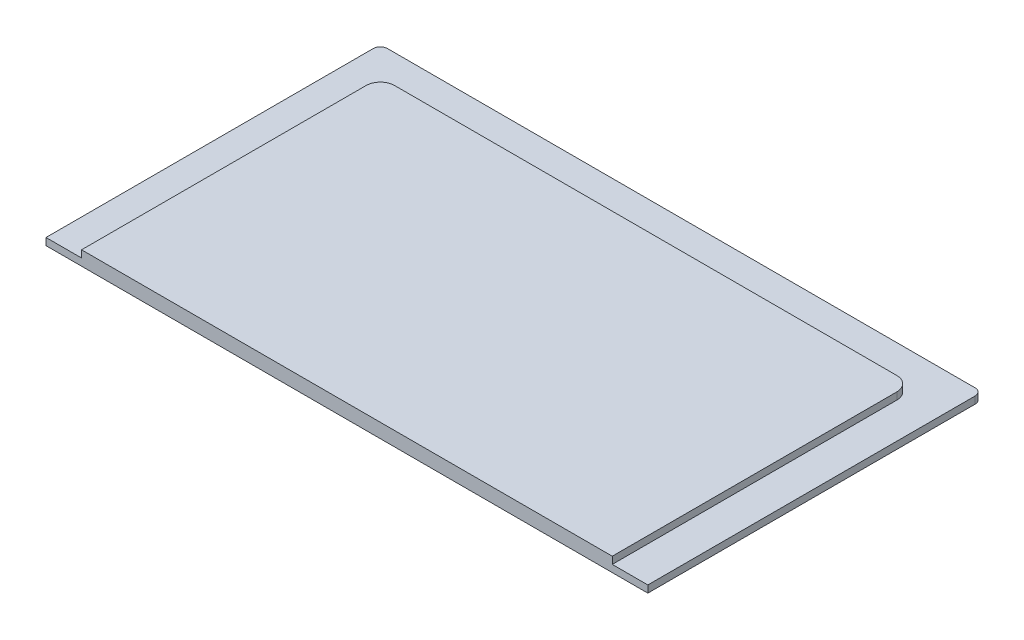
ISO-10303-21;
HEADER;
FILE_DESCRIPTION(('STEP AP214'),'2;1');
FILE_NAME('part.step','',(''),(''),'','','');
FILE_SCHEMA(('AUTOMOTIVE_DESIGN { 1 0 10303 214 1 1 1 1 }'));
ENDSEC;
DATA;
#1=APPLICATION_CONTEXT('core data for automotive mechanical design processes');
#2=APPLICATION_PROTOCOL_DEFINITION('international standard','automotive_design',2000,#1);
#3=PRODUCT_CONTEXT('',#1,'mechanical');
#4=PRODUCT('Part','Part','',(#3));
#5=PRODUCT_RELATED_PRODUCT_CATEGORY('part','',(#4));
#6=PRODUCT_DEFINITION_FORMATION('','',#4);
#7=PRODUCT_DEFINITION_CONTEXT('part definition',#1,'design');
#8=PRODUCT_DEFINITION('design','',#6,#7);
#9=PRODUCT_DEFINITION_SHAPE('','',#8);
#10=(LENGTH_UNIT() NAMED_UNIT(*) SI_UNIT(.MILLI.,.METRE.));
#11=(NAMED_UNIT(*) PLANE_ANGLE_UNIT() SI_UNIT($,.RADIAN.));
#12=(NAMED_UNIT(*) SI_UNIT($,.STERADIAN.) SOLID_ANGLE_UNIT());
#13=UNCERTAINTY_MEASURE_WITH_UNIT(LENGTH_MEASURE(1.E-05),#10,'distance_accuracy_value','');
#14=(GEOMETRIC_REPRESENTATION_CONTEXT(3) GLOBAL_UNCERTAINTY_ASSIGNED_CONTEXT((#13)) GLOBAL_UNIT_ASSIGNED_CONTEXT((#10,
#11,#12)) REPRESENTATION_CONTEXT('',''));
#15=CARTESIAN_POINT('',(0.,0.,0.));
#16=DIRECTION('',(0.,0.,1.));
#17=DIRECTION('',(1.,0.,0.));
#18=AXIS2_PLACEMENT_3D('',#15,#16,#17);
#19=CARTESIAN_POINT('',(37.3,1.,21.));
#20=DIRECTION('',(-1.,0.,0.));
#21=DIRECTION('',(0.,0.,1.));
#22=AXIS2_PLACEMENT_3D('',#19,#20,#21);
#23=PLANE('',#22);
#24=DIRECTION('',(0.,0.,-1.));
#25=VECTOR('',#24,1.);
#26=CARTESIAN_POINT('',(37.3,0.,21.));
#27=LINE('',#26,#25);
#28=CARTESIAN_POINT('',(37.3,0.,21.));
#29=VERTEX_POINT('',#28);
#30=CARTESIAN_POINT('',(37.3,0.,-19.));
#31=VERTEX_POINT('',#30);
#32=EDGE_CURVE('E145',#29,#31,#27,.T.);
#33=ORIENTED_EDGE('',*,*,#32,.T.);
#34=DIRECTION('',(0.,-1.,0.));
#35=VECTOR('',#34,1.);
#36=CARTESIAN_POINT('',(37.3,1.,-19.));
#37=LINE('',#36,#35);
#38=CARTESIAN_POINT('',(37.3,1.,-19.));
#39=VERTEX_POINT('',#38);
#40=EDGE_CURVE('E203',#31,#39,#37,.F.);
#41=ORIENTED_EDGE('',*,*,#40,.T.);
#42=DIRECTION('',(0.,0.,-1.));
#43=VECTOR('',#42,1.);
#44=CARTESIAN_POINT('',(37.3,1.,21.));
#45=LINE('',#44,#43);
#46=CARTESIAN_POINT('',(37.3,1.,21.));
#47=VERTEX_POINT('',#46);
#48=EDGE_CURVE('E164',#47,#39,#45,.T.);
#49=ORIENTED_EDGE('',*,*,#48,.F.);
#50=DIRECTION('',(0.,-1.,0.));
#51=VECTOR('',#50,1.);
#52=CARTESIAN_POINT('',(37.3,1.,21.));
#53=LINE('',#52,#51);
#54=EDGE_CURVE('E175',#47,#29,#53,.T.);
#55=ORIENTED_EDGE('',*,*,#54,.T.);
#56=EDGE_LOOP('',(#33,#41,#49,#55));
#57=FACE_BOUND('',#56,.T.);
#58=ADVANCED_FACE('F35',(#57),#23,.F.);
#59=CARTESIAN_POINT('',(-37.3,1.,-21.));
#60=DIRECTION('',(0.,0.,1.));
#61=DIRECTION('',(1.,0.,0.));
#62=AXIS2_PLACEMENT_3D('',#59,#60,#61);
#63=PLANE('',#62);
#64=DIRECTION('',(-1.,0.,0.));
#65=VECTOR('',#64,1.);
#66=CARTESIAN_POINT('',(-37.3,0.,-21.));
#67=LINE('',#66,#65);
#68=CARTESIAN_POINT('',(35.3,0.,-21.));
#69=VERTEX_POINT('',#68);
#70=CARTESIAN_POINT('',(-35.3,0.,-21.));
#71=VERTEX_POINT('',#70);
#72=EDGE_CURVE('E178',#69,#71,#67,.T.);
#73=ORIENTED_EDGE('',*,*,#72,.T.);
#74=DIRECTION('',(0.,-1.,0.));
#75=VECTOR('',#74,1.);
#76=CARTESIAN_POINT('',(-35.3,1.,-21.));
#77=LINE('',#76,#75);
#78=CARTESIAN_POINT('',(-35.3,1.,-21.));
#79=VERTEX_POINT('',#78);
#80=EDGE_CURVE('E197',#71,#79,#77,.F.);
#81=ORIENTED_EDGE('',*,*,#80,.T.);
#82=DIRECTION('',(-1.,0.,0.));
#83=VECTOR('',#82,1.);
#84=CARTESIAN_POINT('',(-37.3,1.,-21.));
#85=LINE('',#84,#83);
#86=CARTESIAN_POINT('',(35.3,1.,-21.));
#87=VERTEX_POINT('',#86);
#88=EDGE_CURVE('E167',#87,#79,#85,.T.);
#89=ORIENTED_EDGE('',*,*,#88,.F.);
#90=DIRECTION('',(0.,-1.,0.));
#91=VECTOR('',#90,1.);
#92=CARTESIAN_POINT('',(35.3,1.,-21.));
#93=LINE('',#92,#91);
#94=EDGE_CURVE('E194',#87,#69,#93,.T.);
#95=ORIENTED_EDGE('',*,*,#94,.T.);
#96=EDGE_LOOP('',(#73,#81,#89,#95));
#97=FACE_BOUND('',#96,.T.);
#98=ADVANCED_FACE('F239',(#97),#63,.F.);
#99=CARTESIAN_POINT('',(-37.3,1.,21.));
#100=DIRECTION('',(1.,0.,0.));
#101=DIRECTION('',(0.,0.,-1.));
#102=AXIS2_PLACEMENT_3D('',#99,#100,#101);
#103=PLANE('',#102);
#104=DIRECTION('',(0.,0.,1.));
#105=VECTOR('',#104,1.);
#106=CARTESIAN_POINT('',(-37.3,1.,21.));
#107=LINE('',#106,#105);
#108=CARTESIAN_POINT('',(-37.3,1.,-19.));
#109=VERTEX_POINT('',#108);
#110=CARTESIAN_POINT('',(-37.3,1.,21.));
#111=VERTEX_POINT('',#110);
#112=EDGE_CURVE('E171',#109,#111,#107,.T.);
#113=ORIENTED_EDGE('',*,*,#112,.F.);
#114=DIRECTION('',(0.,-1.,0.));
#115=VECTOR('',#114,1.);
#116=CARTESIAN_POINT('',(-37.3,1.,-19.));
#117=LINE('',#116,#115);
#118=CARTESIAN_POINT('',(-37.3,0.,-19.));
#119=VERTEX_POINT('',#118);
#120=EDGE_CURVE('E187',#109,#119,#117,.T.);
#121=ORIENTED_EDGE('',*,*,#120,.T.);
#122=DIRECTION('',(0.,0.,1.));
#123=VECTOR('',#122,1.);
#124=CARTESIAN_POINT('',(-37.3,0.,21.));
#125=LINE('',#124,#123);
#126=CARTESIAN_POINT('',(-37.3,0.,21.));
#127=VERTEX_POINT('',#126);
#128=EDGE_CURVE('E168',#119,#127,#125,.T.);
#129=ORIENTED_EDGE('',*,*,#128,.T.);
#130=DIRECTION('',(0.,-1.,0.));
#131=VECTOR('',#130,1.);
#132=CARTESIAN_POINT('',(-37.3,1.,21.));
#133=LINE('',#132,#131);
#134=EDGE_CURVE('E185',#111,#127,#133,.T.);
#135=ORIENTED_EDGE('',*,*,#134,.F.);
#136=EDGE_LOOP('',(#113,#121,#129,#135));
#137=FACE_BOUND('',#136,.T.);
#138=ADVANCED_FACE('F245',(#137),#103,.F.);
#139=CARTESIAN_POINT('',(-37.3,1.,21.));
#140=DIRECTION('',(0.,0.,-1.));
#141=DIRECTION('',(-1.,0.,0.));
#142=AXIS2_PLACEMENT_3D('',#139,#140,#141);
#143=PLANE('',#142);
#144=ORIENTED_EDGE('',*,*,#134,.T.);
#145=DIRECTION('',(-1.,0.,0.));
#146=VECTOR('',#145,1.);
#147=CARTESIAN_POINT('',(-42.3,0.,21.));
#148=LINE('',#147,#146);
#149=CARTESIAN_POINT('',(-42.3,0.,21.));
#150=VERTEX_POINT('',#149);
#151=EDGE_CURVE('E160',#127,#150,#148,.T.);
#152=ORIENTED_EDGE('',*,*,#151,.T.);
#153=DIRECTION('',(0.,1.,0.));
#154=VECTOR('',#153,1.);
#155=CARTESIAN_POINT('',(-42.3,-1.,21.));
#156=LINE('',#155,#154);
#157=CARTESIAN_POINT('',(-42.3,-1.,21.));
#158=VERTEX_POINT('',#157);
#159=EDGE_CURVE('E146',#158,#150,#156,.T.);
#160=ORIENTED_EDGE('',*,*,#159,.F.);
#161=DIRECTION('',(-1.,0.,0.));
#162=VECTOR('',#161,1.);
#163=CARTESIAN_POINT('',(-42.3,-1.,21.));
#164=LINE('',#163,#162);
#165=CARTESIAN_POINT('',(42.3,-1.,21.));
#166=VERTEX_POINT('',#165);
#167=EDGE_CURVE('E129',#166,#158,#164,.T.);
#168=ORIENTED_EDGE('',*,*,#167,.F.);
#169=DIRECTION('',(0.,1.,0.));
#170=VECTOR('',#169,1.);
#171=CARTESIAN_POINT('',(42.3,-1.,21.));
#172=LINE('',#171,#170);
#173=CARTESIAN_POINT('',(42.3,0.,21.));
#174=VERTEX_POINT('',#173);
#175=EDGE_CURVE('E138',#166,#174,#172,.T.);
#176=ORIENTED_EDGE('',*,*,#175,.T.);
#177=EDGE_CURVE('E161',#174,#29,#148,.T.);
#178=ORIENTED_EDGE('',*,*,#177,.T.);
#179=ORIENTED_EDGE('',*,*,#54,.F.);
#180=DIRECTION('',(1.,0.,0.));
#181=VECTOR('',#180,1.);
#182=CARTESIAN_POINT('',(-37.3,1.,21.));
#183=LINE('',#182,#181);
#184=EDGE_CURVE('E173',#111,#47,#183,.T.);
#185=ORIENTED_EDGE('',*,*,#184,.F.);
#186=EDGE_LOOP('',(#144,#152,#160,#168,#176,#178,#179,#185));
#187=FACE_BOUND('',#186,.T.);
#188=ADVANCED_FACE('F149',(#187),#143,.F.);
#189=CARTESIAN_POINT('',(0.,1.,0.));
#190=DIRECTION('',(0.,-1.,0.));
#191=DIRECTION('',(0.,0.,-1.));
#192=AXIS2_PLACEMENT_3D('',#189,#190,#191);
#193=PLANE('',#192);
#194=ORIENTED_EDGE('',*,*,#88,.T.);
#195=CARTESIAN_POINT('',(-35.3,1.,-19.));
#196=DIRECTION('',(0.,-1.,0.));
#197=DIRECTION('',(0.,0.,-1.));
#198=AXIS2_PLACEMENT_3D('',#195,#196,#197);
#199=CIRCLE('',#198,2.);
#200=EDGE_CURVE('E201',#79,#109,#199,.F.);
#201=ORIENTED_EDGE('',*,*,#200,.T.);
#202=ORIENTED_EDGE('',*,*,#112,.T.);
#203=ORIENTED_EDGE('',*,*,#184,.T.);
#204=ORIENTED_EDGE('',*,*,#48,.T.);
#205=CARTESIAN_POINT('',(35.3,1.,-19.));
#206=DIRECTION('',(0.,-1.,0.));
#207=DIRECTION('',(0.,0.,-1.));
#208=AXIS2_PLACEMENT_3D('',#205,#206,#207);
#209=CIRCLE('',#208,2.);
#210=EDGE_CURVE('E199',#39,#87,#209,.F.);
#211=ORIENTED_EDGE('',*,*,#210,.T.);
#212=EDGE_LOOP('',(#194,#201,#202,#203,#204,#211));
#213=FACE_BOUND('',#212,.T.);
#214=ADVANCED_FACE('F251',(#213),#193,.F.);
#215=CARTESIAN_POINT('',(-35.3,1.,-19.));
#216=DIRECTION('',(0.,-1.,0.));
#217=DIRECTION('',(0.,0.,-1.));
#218=AXIS2_PLACEMENT_3D('',#215,#216,#217);
#219=CYLINDRICAL_SURFACE('',#218,2.);
#220=ORIENTED_EDGE('',*,*,#200,.F.);
#221=ORIENTED_EDGE('',*,*,#80,.F.);
#222=CARTESIAN_POINT('',(-35.3,0.,-19.));
#223=DIRECTION('',(0.,-1.,0.));
#224=DIRECTION('',(0.,0.,-1.));
#225=AXIS2_PLACEMENT_3D('',#222,#223,#224);
#226=CIRCLE('',#225,2.);
#227=EDGE_CURVE('E192',#119,#71,#226,.T.);
#228=ORIENTED_EDGE('',*,*,#227,.F.);
#229=ORIENTED_EDGE('',*,*,#120,.F.);
#230=EDGE_LOOP('',(#220,#221,#228,#229));
#231=FACE_BOUND('',#230,.T.);
#232=ADVANCED_FACE('F234',(#231),#219,.T.);
#233=CARTESIAN_POINT('',(35.3,1.,-19.));
#234=DIRECTION('',(0.,-1.,0.));
#235=DIRECTION('',(0.,0.,-1.));
#236=AXIS2_PLACEMENT_3D('',#233,#234,#235);
#237=CYLINDRICAL_SURFACE('',#236,2.);
#238=ORIENTED_EDGE('',*,*,#210,.F.);
#239=ORIENTED_EDGE('',*,*,#40,.F.);
#240=CARTESIAN_POINT('',(35.3,0.,-19.));
#241=DIRECTION('',(0.,-1.,0.));
#242=DIRECTION('',(0.,0.,-1.));
#243=AXIS2_PLACEMENT_3D('',#240,#241,#242);
#244=CIRCLE('',#243,2.);
#245=EDGE_CURVE('E190',#69,#31,#244,.T.);
#246=ORIENTED_EDGE('',*,*,#245,.F.);
#247=ORIENTED_EDGE('',*,*,#94,.F.);
#248=EDGE_LOOP('',(#238,#239,#246,#247));
#249=FACE_BOUND('',#248,.T.);
#250=ADVANCED_FACE('F227',(#249),#237,.T.);
#251=CARTESIAN_POINT('',(-42.3,-1.,21.));
#252=DIRECTION('',(1.,0.,0.));
#253=DIRECTION('',(0.,0.,-1.));
#254=AXIS2_PLACEMENT_3D('',#251,#252,#253);
#255=PLANE('',#254);
#256=DIRECTION('',(0.,0.,-1.));
#257=VECTOR('',#256,1.);
#258=CARTESIAN_POINT('',(-42.3,0.,21.));
#259=LINE('',#258,#257);
#260=CARTESIAN_POINT('',(-42.3,0.,-25.));
#261=VERTEX_POINT('',#260);
#262=EDGE_CURVE('E155',#150,#261,#259,.T.);
#263=ORIENTED_EDGE('',*,*,#262,.T.);
#264=DIRECTION('',(0.,1.,0.));
#265=VECTOR('',#264,1.);
#266=CARTESIAN_POINT('',(-42.3,-1.,-25.));
#267=LINE('',#266,#265);
#268=CARTESIAN_POINT('',(-42.3,-1.,-25.));
#269=VERTEX_POINT('',#268);
#270=EDGE_CURVE('E11',#261,#269,#267,.F.);
#271=ORIENTED_EDGE('',*,*,#270,.T.);
#272=DIRECTION('',(0.,0.,-1.));
#273=VECTOR('',#272,1.);
#274=CARTESIAN_POINT('',(-42.3,-1.,21.));
#275=LINE('',#274,#273);
#276=EDGE_CURVE('E162',#158,#269,#275,.T.);
#277=ORIENTED_EDGE('',*,*,#276,.F.);
#278=ORIENTED_EDGE('',*,*,#159,.T.);
#279=EDGE_LOOP('',(#263,#271,#277,#278));
#280=FACE_BOUND('',#279,.T.);
#281=ADVANCED_FACE('F224',(#280),#255,.F.);
#282=CARTESIAN_POINT('',(-42.3,-1.,-26.));
#283=DIRECTION('',(0.,0.,1.));
#284=DIRECTION('',(1.,0.,0.));
#285=AXIS2_PLACEMENT_3D('',#282,#283,#284);
#286=PLANE('',#285);
#287=DIRECTION('',(1.,0.,0.));
#288=VECTOR('',#287,1.);
#289=CARTESIAN_POINT('',(-42.3,0.,-26.));
#290=LINE('',#289,#288);
#291=CARTESIAN_POINT('',(-41.3,0.,-26.));
#292=VERTEX_POINT('',#291);
#293=CARTESIAN_POINT('',(41.3,0.,-26.));
#294=VERTEX_POINT('',#293);
#295=EDGE_CURVE('E157',#292,#294,#290,.T.);
#296=ORIENTED_EDGE('',*,*,#295,.T.);
#297=DIRECTION('',(0.,1.,0.));
#298=VECTOR('',#297,1.);
#299=CARTESIAN_POINT('',(41.3,-1.,-26.));
#300=LINE('',#299,#298);
#301=CARTESIAN_POINT('',(41.3,-1.,-26.));
#302=VERTEX_POINT('',#301);
#303=EDGE_CURVE('E56',#294,#302,#300,.F.);
#304=ORIENTED_EDGE('',*,*,#303,.T.);
#305=DIRECTION('',(1.,0.,0.));
#306=VECTOR('',#305,1.);
#307=CARTESIAN_POINT('',(-42.3,-1.,-26.));
#308=LINE('',#307,#306);
#309=CARTESIAN_POINT('',(-41.3,-1.,-26.));
#310=VERTEX_POINT('',#309);
#311=EDGE_CURVE('E135',#310,#302,#308,.T.);
#312=ORIENTED_EDGE('',*,*,#311,.F.);
#313=DIRECTION('',(0.,1.,0.));
#314=VECTOR('',#313,1.);
#315=CARTESIAN_POINT('',(-41.3,-1.,-26.));
#316=LINE('',#315,#314);
#317=EDGE_CURVE('E211',#310,#292,#316,.T.);
#318=ORIENTED_EDGE('',*,*,#317,.T.);
#319=EDGE_LOOP('',(#296,#304,#312,#318));
#320=FACE_BOUND('',#319,.T.);
#321=ADVANCED_FACE('F219',(#320),#286,.F.);
#322=CARTESIAN_POINT('',(42.3,-1.,21.));
#323=DIRECTION('',(-1.,0.,0.));
#324=DIRECTION('',(0.,0.,1.));
#325=AXIS2_PLACEMENT_3D('',#322,#323,#324);
#326=PLANE('',#325);
#327=DIRECTION('',(0.,0.,1.));
#328=VECTOR('',#327,1.);
#329=CARTESIAN_POINT('',(42.3,-1.,21.));
#330=LINE('',#329,#328);
#331=CARTESIAN_POINT('',(42.3,-1.,-25.));
#332=VERTEX_POINT('',#331);
#333=EDGE_CURVE('E125',#332,#166,#330,.T.);
#334=ORIENTED_EDGE('',*,*,#333,.F.);
#335=DIRECTION('',(0.,1.,0.));
#336=VECTOR('',#335,1.);
#337=CARTESIAN_POINT('',(42.3,-1.,-25.));
#338=LINE('',#337,#336);
#339=CARTESIAN_POINT('',(42.3,0.,-25.));
#340=VERTEX_POINT('',#339);
#341=EDGE_CURVE('E205',#332,#340,#338,.T.);
#342=ORIENTED_EDGE('',*,*,#341,.T.);
#343=DIRECTION('',(0.,0.,1.));
#344=VECTOR('',#343,1.);
#345=CARTESIAN_POINT('',(42.3,0.,21.));
#346=LINE('',#345,#344);
#347=EDGE_CURVE('E141',#340,#174,#346,.T.);
#348=ORIENTED_EDGE('',*,*,#347,.T.);
#349=ORIENTED_EDGE('',*,*,#175,.F.);
#350=EDGE_LOOP('',(#334,#342,#348,#349));
#351=FACE_BOUND('',#350,.T.);
#352=ADVANCED_FACE('F139',(#351),#326,.F.);
#353=CARTESIAN_POINT('',(0.,-1.,0.));
#354=DIRECTION('',(0.,-1.,0.));
#355=DIRECTION('',(0.,0.,-1.));
#356=AXIS2_PLACEMENT_3D('',#353,#354,#355);
#357=PLANE('',#356);
#358=ORIENTED_EDGE('',*,*,#311,.T.);
#359=CARTESIAN_POINT('',(41.3,-1.,-25.));
#360=DIRECTION('',(0.,-1.,0.));
#361=DIRECTION('',(0.,0.,-1.));
#362=AXIS2_PLACEMENT_3D('',#359,#360,#361);
#363=CIRCLE('',#362,1.);
#364=EDGE_CURVE('E43',#302,#332,#363,.T.);
#365=ORIENTED_EDGE('',*,*,#364,.T.);
#366=ORIENTED_EDGE('',*,*,#333,.T.);
#367=ORIENTED_EDGE('',*,*,#167,.T.);
#368=ORIENTED_EDGE('',*,*,#276,.T.);
#369=CARTESIAN_POINT('',(-41.3,-1.,-25.));
#370=DIRECTION('',(0.,-1.,0.));
#371=DIRECTION('',(0.,0.,-1.));
#372=AXIS2_PLACEMENT_3D('',#369,#370,#371);
#373=CIRCLE('',#372,1.);
#374=EDGE_CURVE('E215',#269,#310,#373,.T.);
#375=ORIENTED_EDGE('',*,*,#374,.T.);
#376=EDGE_LOOP('',(#358,#365,#366,#367,#368,#375));
#377=FACE_BOUND('',#376,.T.);
#378=ADVANCED_FACE('F127',(#377),#357,.T.);
#379=CARTESIAN_POINT('',(0.,0.,0.));
#380=DIRECTION('',(0.,-1.,0.));
#381=DIRECTION('',(0.,0.,-1.));
#382=AXIS2_PLACEMENT_3D('',#379,#380,#381);
#383=PLANE('',#382);
#384=ORIENTED_EDGE('',*,*,#347,.F.);
#385=CARTESIAN_POINT('',(41.3,0.,-25.));
#386=DIRECTION('',(0.,-1.,0.));
#387=DIRECTION('',(0.,0.,-1.));
#388=AXIS2_PLACEMENT_3D('',#385,#386,#387);
#389=CIRCLE('',#388,1.);
#390=EDGE_CURVE('E209',#340,#294,#389,.F.);
#391=ORIENTED_EDGE('',*,*,#390,.T.);
#392=ORIENTED_EDGE('',*,*,#295,.F.);
#393=CARTESIAN_POINT('',(-41.3,0.,-25.));
#394=DIRECTION('',(0.,-1.,0.));
#395=DIRECTION('',(0.,0.,-1.));
#396=AXIS2_PLACEMENT_3D('',#393,#394,#395);
#397=CIRCLE('',#396,1.);
#398=EDGE_CURVE('E207',#292,#261,#397,.F.);
#399=ORIENTED_EDGE('',*,*,#398,.T.);
#400=ORIENTED_EDGE('',*,*,#262,.F.);
#401=ORIENTED_EDGE('',*,*,#151,.F.);
#402=ORIENTED_EDGE('',*,*,#128,.F.);
#403=ORIENTED_EDGE('',*,*,#227,.T.);
#404=ORIENTED_EDGE('',*,*,#72,.F.);
#405=ORIENTED_EDGE('',*,*,#245,.T.);
#406=ORIENTED_EDGE('',*,*,#32,.F.);
#407=ORIENTED_EDGE('',*,*,#177,.F.);
#408=EDGE_LOOP('',(#384,#391,#392,#399,#400,#401,#402,#403,#404,#405,#406,#407));
#409=FACE_BOUND('',#408,.T.);
#410=ADVANCED_FACE('F223',(#409),#383,.F.);
#411=CARTESIAN_POINT('',(41.3,-1.,-25.));
#412=DIRECTION('',(0.,1.,0.));
#413=DIRECTION('',(0.,0.,1.));
#414=AXIS2_PLACEMENT_3D('',#411,#412,#413);
#415=CYLINDRICAL_SURFACE('',#414,1.);
#416=ORIENTED_EDGE('',*,*,#364,.F.);
#417=ORIENTED_EDGE('',*,*,#303,.F.);
#418=ORIENTED_EDGE('',*,*,#390,.F.);
#419=ORIENTED_EDGE('',*,*,#341,.F.);
#420=EDGE_LOOP('',(#416,#417,#418,#419));
#421=FACE_BOUND('',#420,.T.);
#422=ADVANCED_FACE('F253',(#421),#415,.T.);
#423=CARTESIAN_POINT('',(-41.3,-1.,-25.));
#424=DIRECTION('',(0.,1.,0.));
#425=DIRECTION('',(0.,0.,1.));
#426=AXIS2_PLACEMENT_3D('',#423,#424,#425);
#427=CYLINDRICAL_SURFACE('',#426,1.);
#428=ORIENTED_EDGE('',*,*,#374,.F.);
#429=ORIENTED_EDGE('',*,*,#270,.F.);
#430=ORIENTED_EDGE('',*,*,#398,.F.);
#431=ORIENTED_EDGE('',*,*,#317,.F.);
#432=EDGE_LOOP('',(#428,#429,#430,#431));
#433=FACE_BOUND('',#432,.T.);
#434=ADVANCED_FACE('F37',(#433),#427,.T.);
#435=CLOSED_SHELL('',(#58,#98,#138,#188,#214,#232,#250,#281,#321,#352,#378,#410,#422,#434));
#436=MANIFOLD_SOLID_BREP('B2',#435);
#437=ADVANCED_BREP_SHAPE_REPRESENTATION('',(#18,#436),#14);
#438=SHAPE_DEFINITION_REPRESENTATION(#9,#437);
ENDSEC;
END-ISO-10303-21;
